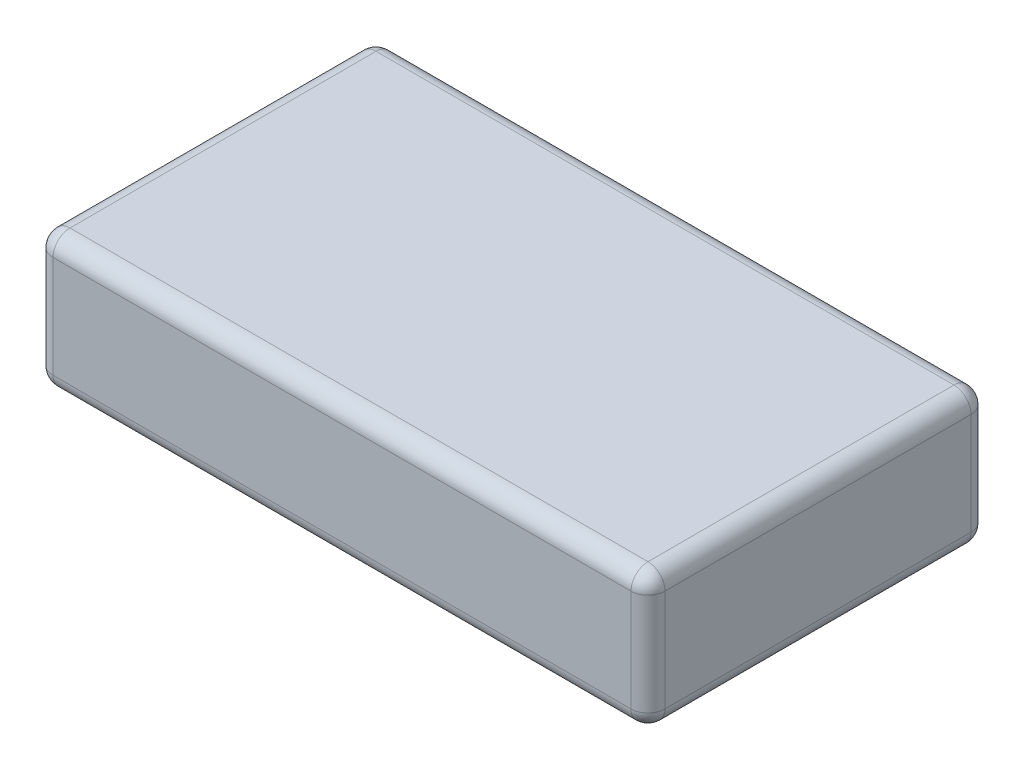
ISO-10303-21;
HEADER;
FILE_DESCRIPTION(('STEP AP214'),'2;1');
FILE_NAME('part.step','',(''),(''),'','','');
FILE_SCHEMA(('AUTOMOTIVE_DESIGN { 1 0 10303 214 1 1 1 1 }'));
ENDSEC;
DATA;
#1=APPLICATION_CONTEXT('core data for automotive mechanical design processes');
#2=APPLICATION_PROTOCOL_DEFINITION('international standard','automotive_design',2000,#1);
#3=PRODUCT_CONTEXT('',#1,'mechanical');
#4=PRODUCT('Part','Part','',(#3));
#5=PRODUCT_RELATED_PRODUCT_CATEGORY('part','',(#4));
#6=PRODUCT_DEFINITION_FORMATION('','',#4);
#7=PRODUCT_DEFINITION_CONTEXT('part definition',#1,'design');
#8=PRODUCT_DEFINITION('design','',#6,#7);
#9=PRODUCT_DEFINITION_SHAPE('','',#8);
#10=(LENGTH_UNIT() NAMED_UNIT(*) SI_UNIT(.MILLI.,.METRE.));
#11=(NAMED_UNIT(*) PLANE_ANGLE_UNIT() SI_UNIT($,.RADIAN.));
#12=(NAMED_UNIT(*) SI_UNIT($,.STERADIAN.) SOLID_ANGLE_UNIT());
#13=UNCERTAINTY_MEASURE_WITH_UNIT(LENGTH_MEASURE(1.E-05),#10,'distance_accuracy_value','');
#14=(GEOMETRIC_REPRESENTATION_CONTEXT(3) GLOBAL_UNCERTAINTY_ASSIGNED_CONTEXT((#13)) GLOBAL_UNIT_ASSIGNED_CONTEXT((#10,
#11,#12)) REPRESENTATION_CONTEXT('',''));
#15=CARTESIAN_POINT('',(0.,0.,0.));
#16=DIRECTION('',(0.,0.,1.));
#17=DIRECTION('',(1.,0.,0.));
#18=AXIS2_PLACEMENT_3D('',#15,#16,#17);
#19=CARTESIAN_POINT('',(-28.575,12.7,15.875));
#20=DIRECTION('',(1.,0.,0.));
#21=DIRECTION('',(0.,0.,-1.));
#22=AXIS2_PLACEMENT_3D('',#19,#20,#21);
#23=PLANE('',#22);
#24=DIRECTION('',(0.,-1.,0.));
#25=VECTOR('',#24,1.);
#26=CARTESIAN_POINT('',(-28.575,12.7,-14.2875));
#27=LINE('',#26,#25);
#28=CARTESIAN_POINT('',(-28.575,11.1125,-14.2875));
#29=VERTEX_POINT('',#28);
#30=CARTESIAN_POINT('',(-28.575,1.5875,-14.2875));
#31=VERTEX_POINT('',#30);
#32=EDGE_CURVE('E141',#29,#31,#27,.T.);
#33=ORIENTED_EDGE('',*,*,#32,.T.);
#34=DIRECTION('',(0.,0.,1.));
#35=VECTOR('',#34,1.);
#36=CARTESIAN_POINT('',(-28.575,1.5875,15.875));
#37=LINE('',#36,#35);
#38=CARTESIAN_POINT('',(-28.575,1.5875,14.2875));
#39=VERTEX_POINT('',#38);
#40=EDGE_CURVE('E188',#31,#39,#37,.T.);
#41=ORIENTED_EDGE('',*,*,#40,.T.);
#42=DIRECTION('',(0.,-1.,0.));
#43=VECTOR('',#42,1.);
#44=CARTESIAN_POINT('',(-28.575,12.7,14.2875));
#45=LINE('',#44,#43);
#46=CARTESIAN_POINT('',(-28.575,11.1125,14.2875));
#47=VERTEX_POINT('',#46);
#48=EDGE_CURVE('E185',#39,#47,#45,.F.);
#49=ORIENTED_EDGE('',*,*,#48,.T.);
#50=DIRECTION('',(0.,0.,1.));
#51=VECTOR('',#50,1.);
#52=CARTESIAN_POINT('',(-28.575,11.1125,15.875));
#53=LINE('',#52,#51);
#54=EDGE_CURVE('E183',#47,#29,#53,.F.);
#55=ORIENTED_EDGE('',*,*,#54,.T.);
#56=EDGE_LOOP('',(#33,#41,#49,#55));
#57=FACE_BOUND('',#56,.T.);
#58=ADVANCED_FACE('F33',(#57),#23,.F.);
#59=CARTESIAN_POINT('',(-28.575,12.7,15.875));
#60=DIRECTION('',(0.,0.,-1.));
#61=DIRECTION('',(-1.,0.,0.));
#62=AXIS2_PLACEMENT_3D('',#59,#60,#61);
#63=PLANE('',#62);
#64=DIRECTION('',(0.,-1.,0.));
#65=VECTOR('',#64,1.);
#66=CARTESIAN_POINT('',(-26.9875,12.7,15.875));
#67=LINE('',#66,#65);
#68=CARTESIAN_POINT('',(-26.9875,11.1125,15.875));
#69=VERTEX_POINT('',#68);
#70=CARTESIAN_POINT('',(-26.9875,1.5875,15.875));
#71=VERTEX_POINT('',#70);
#72=EDGE_CURVE('E176',#69,#71,#67,.T.);
#73=ORIENTED_EDGE('',*,*,#72,.T.);
#74=DIRECTION('',(1.,0.,0.));
#75=VECTOR('',#74,1.);
#76=CARTESIAN_POINT('',(28.575,1.5875,15.875));
#77=LINE('',#76,#75);
#78=CARTESIAN_POINT('',(26.9875,1.5875,15.875));
#79=VERTEX_POINT('',#78);
#80=EDGE_CURVE('E181',#71,#79,#77,.T.);
#81=ORIENTED_EDGE('',*,*,#80,.T.);
#82=DIRECTION('',(0.,-1.,0.));
#83=VECTOR('',#82,1.);
#84=CARTESIAN_POINT('',(26.9875,12.7,15.875));
#85=LINE('',#84,#83);
#86=CARTESIAN_POINT('',(26.9875,11.1125,15.875));
#87=VERTEX_POINT('',#86);
#88=EDGE_CURVE('E178',#79,#87,#85,.F.);
#89=ORIENTED_EDGE('',*,*,#88,.T.);
#90=DIRECTION('',(1.,0.,0.));
#91=VECTOR('',#90,1.);
#92=CARTESIAN_POINT('',(-28.575,11.1125,15.875));
#93=LINE('',#92,#91);
#94=EDGE_CURVE('E174',#87,#69,#93,.F.);
#95=ORIENTED_EDGE('',*,*,#94,.T.);
#96=EDGE_LOOP('',(#73,#81,#89,#95));
#97=FACE_BOUND('',#96,.T.);
#98=ADVANCED_FACE('F293',(#97),#63,.F.);
#99=CARTESIAN_POINT('',(28.575,12.7,15.875));
#100=DIRECTION('',(-1.,0.,0.));
#101=DIRECTION('',(0.,0.,1.));
#102=AXIS2_PLACEMENT_3D('',#99,#100,#101);
#103=PLANE('',#102);
#104=DIRECTION('',(0.,-1.,0.));
#105=VECTOR('',#104,1.);
#106=CARTESIAN_POINT('',(28.575,12.7,14.2875));
#107=LINE('',#106,#105);
#108=CARTESIAN_POINT('',(28.575,11.1125,14.2875));
#109=VERTEX_POINT('',#108);
#110=CARTESIAN_POINT('',(28.575,1.5875,14.2875));
#111=VERTEX_POINT('',#110);
#112=EDGE_CURVE('E167',#109,#111,#107,.T.);
#113=ORIENTED_EDGE('',*,*,#112,.T.);
#114=DIRECTION('',(0.,0.,-1.));
#115=VECTOR('',#114,1.);
#116=CARTESIAN_POINT('',(28.575,1.5875,-15.875));
#117=LINE('',#116,#115);
#118=CARTESIAN_POINT('',(28.575,1.5875,-14.2875));
#119=VERTEX_POINT('',#118);
#120=EDGE_CURVE('E172',#111,#119,#117,.T.);
#121=ORIENTED_EDGE('',*,*,#120,.T.);
#122=DIRECTION('',(0.,-1.,0.));
#123=VECTOR('',#122,1.);
#124=CARTESIAN_POINT('',(28.575,12.7,-14.2875));
#125=LINE('',#124,#123);
#126=CARTESIAN_POINT('',(28.575,11.1125,-14.2875));
#127=VERTEX_POINT('',#126);
#128=EDGE_CURVE('E169',#119,#127,#125,.F.);
#129=ORIENTED_EDGE('',*,*,#128,.T.);
#130=DIRECTION('',(0.,0.,-1.));
#131=VECTOR('',#130,1.);
#132=CARTESIAN_POINT('',(28.575,11.1125,15.875));
#133=LINE('',#132,#131);
#134=EDGE_CURVE('E165',#127,#109,#133,.F.);
#135=ORIENTED_EDGE('',*,*,#134,.T.);
#136=EDGE_LOOP('',(#113,#121,#129,#135));
#137=FACE_BOUND('',#136,.T.);
#138=ADVANCED_FACE('F284',(#137),#103,.F.);
#139=CARTESIAN_POINT('',(-28.575,12.7,-15.875));
#140=DIRECTION('',(0.,0.,1.));
#141=DIRECTION('',(1.,0.,0.));
#142=AXIS2_PLACEMENT_3D('',#139,#140,#141);
#143=PLANE('',#142);
#144=DIRECTION('',(0.,-1.,0.));
#145=VECTOR('',#144,1.);
#146=CARTESIAN_POINT('',(26.9875,12.7,-15.875));
#147=LINE('',#146,#145);
#148=CARTESIAN_POINT('',(26.9875,11.1125,-15.875));
#149=VERTEX_POINT('',#148);
#150=CARTESIAN_POINT('',(26.9875,1.5875,-15.875));
#151=VERTEX_POINT('',#150);
#152=EDGE_CURVE('E133',#149,#151,#147,.T.);
#153=ORIENTED_EDGE('',*,*,#152,.T.);
#154=DIRECTION('',(-1.,0.,0.));
#155=VECTOR('',#154,1.);
#156=CARTESIAN_POINT('',(-28.575,1.5875,-15.875));
#157=LINE('',#156,#155);
#158=CARTESIAN_POINT('',(-26.9875,1.5875,-15.875));
#159=VERTEX_POINT('',#158);
#160=EDGE_CURVE('E129',#151,#159,#157,.T.);
#161=ORIENTED_EDGE('',*,*,#160,.T.);
#162=DIRECTION('',(0.,-1.,0.));
#163=VECTOR('',#162,1.);
#164=CARTESIAN_POINT('',(-26.9875,12.7,-15.875));
#165=LINE('',#164,#163);
#166=CARTESIAN_POINT('',(-26.9875,11.1125,-15.875));
#167=VERTEX_POINT('',#166);
#168=EDGE_CURVE('E121',#159,#167,#165,.F.);
#169=ORIENTED_EDGE('',*,*,#168,.T.);
#170=DIRECTION('',(-1.,0.,0.));
#171=VECTOR('',#170,1.);
#172=CARTESIAN_POINT('',(-28.575,11.1125,-15.875));
#173=LINE('',#172,#171);
#174=EDGE_CURVE('E126',#167,#149,#173,.F.);
#175=ORIENTED_EDGE('',*,*,#174,.T.);
#176=EDGE_LOOP('',(#153,#161,#169,#175));
#177=FACE_BOUND('',#176,.T.);
#178=ADVANCED_FACE('F124',(#177),#143,.F.);
#179=CARTESIAN_POINT('',(0.,12.7,0.));
#180=DIRECTION('',(0.,-1.,0.));
#181=DIRECTION('',(0.,0.,-1.));
#182=AXIS2_PLACEMENT_3D('',#179,#180,#181);
#183=PLANE('',#182);
#184=DIRECTION('',(0.,0.,-1.));
#185=VECTOR('',#184,1.);
#186=CARTESIAN_POINT('',(26.9875,12.7,0.));
#187=LINE('',#186,#185);
#188=CARTESIAN_POINT('',(26.9875,12.7,14.2875));
#189=VERTEX_POINT('',#188);
#190=CARTESIAN_POINT('',(26.9875,12.7,-14.2875));
#191=VERTEX_POINT('',#190);
#192=EDGE_CURVE('E42',#189,#191,#187,.T.);
#193=ORIENTED_EDGE('',*,*,#192,.T.);
#194=DIRECTION('',(-1.,0.,0.));
#195=VECTOR('',#194,1.);
#196=CARTESIAN_POINT('',(0.,12.7,-14.2875));
#197=LINE('',#196,#195);
#198=CARTESIAN_POINT('',(-26.9875,12.7,-14.2875));
#199=VERTEX_POINT('',#198);
#200=EDGE_CURVE('E11',#191,#199,#197,.T.);
#201=ORIENTED_EDGE('',*,*,#200,.T.);
#202=DIRECTION('',(0.,0.,1.));
#203=VECTOR('',#202,1.);
#204=CARTESIAN_POINT('',(-26.9875,12.7,0.));
#205=LINE('',#204,#203);
#206=CARTESIAN_POINT('',(-26.9875,12.7,14.2875));
#207=VERTEX_POINT('',#206);
#208=EDGE_CURVE('E199',#199,#207,#205,.T.);
#209=ORIENTED_EDGE('',*,*,#208,.T.);
#210=DIRECTION('',(1.,0.,0.));
#211=VECTOR('',#210,1.);
#212=CARTESIAN_POINT('',(0.,12.7,14.2875));
#213=LINE('',#212,#211);
#214=EDGE_CURVE('E53',#207,#189,#213,.T.);
#215=ORIENTED_EDGE('',*,*,#214,.T.);
#216=EDGE_LOOP('',(#193,#201,#209,#215));
#217=FACE_BOUND('',#216,.T.);
#218=ADVANCED_FACE('F483',(#217),#183,.F.);
#219=CARTESIAN_POINT('',(0.,0.,0.));
#220=DIRECTION('',(0.,-1.,0.));
#221=DIRECTION('',(0.,0.,-1.));
#222=AXIS2_PLACEMENT_3D('',#219,#220,#221);
#223=PLANE('',#222);
#224=DIRECTION('',(0.,0.,-1.));
#225=VECTOR('',#224,1.);
#226=CARTESIAN_POINT('',(26.9875,0.,15.875));
#227=LINE('',#226,#225);
#228=CARTESIAN_POINT('',(26.9875,0.,-14.2875));
#229=VERTEX_POINT('',#228);
#230=CARTESIAN_POINT('',(26.9875,0.,14.2875));
#231=VERTEX_POINT('',#230);
#232=EDGE_CURVE('E194',#229,#231,#227,.F.);
#233=ORIENTED_EDGE('',*,*,#232,.T.);
#234=DIRECTION('',(1.,0.,0.));
#235=VECTOR('',#234,1.);
#236=CARTESIAN_POINT('',(-28.575,0.,14.2875));
#237=LINE('',#236,#235);
#238=CARTESIAN_POINT('',(-26.9875,0.,14.2875));
#239=VERTEX_POINT('',#238);
#240=EDGE_CURVE('E196',#231,#239,#237,.F.);
#241=ORIENTED_EDGE('',*,*,#240,.T.);
#242=DIRECTION('',(0.,0.,1.));
#243=VECTOR('',#242,1.);
#244=CARTESIAN_POINT('',(-26.9875,0.,-15.875));
#245=LINE('',#244,#243);
#246=CARTESIAN_POINT('',(-26.9875,0.,-14.2875));
#247=VERTEX_POINT('',#246);
#248=EDGE_CURVE('E190',#239,#247,#245,.F.);
#249=ORIENTED_EDGE('',*,*,#248,.T.);
#250=DIRECTION('',(-1.,0.,0.));
#251=VECTOR('',#250,1.);
#252=CARTESIAN_POINT('',(28.575,0.,-14.2875));
#253=LINE('',#252,#251);
#254=EDGE_CURVE('E192',#247,#229,#253,.F.);
#255=ORIENTED_EDGE('',*,*,#254,.T.);
#256=EDGE_LOOP('',(#233,#241,#249,#255));
#257=FACE_BOUND('',#256,.T.);
#258=ADVANCED_FACE('F266',(#257),#223,.T.);
#259=CARTESIAN_POINT('',(-26.9875,12.7,14.2875));
#260=DIRECTION('',(0.,-1.,0.));
#261=DIRECTION('',(0.,0.,-1.));
#262=AXIS2_PLACEMENT_3D('',#259,#260,#261);
#263=CYLINDRICAL_SURFACE('',#262,1.5875);
#264=CARTESIAN_POINT('',(-26.9875,11.1125,14.2875));
#265=DIRECTION('',(0.,1.,0.));
#266=DIRECTION('',(0.,0.,1.));
#267=AXIS2_PLACEMENT_3D('',#264,#265,#266);
#268=CIRCLE('',#267,1.5875);
#269=EDGE_CURVE('E37',#47,#69,#268,.T.);
#270=ORIENTED_EDGE('',*,*,#269,.F.);
#271=ORIENTED_EDGE('',*,*,#48,.F.);
#272=CARTESIAN_POINT('',(-26.9875,1.5875,14.2875));
#273=DIRECTION('',(0.,-1.,0.));
#274=DIRECTION('',(0.,0.,-1.));
#275=AXIS2_PLACEMENT_3D('',#272,#273,#274);
#276=CIRCLE('',#275,1.5875);
#277=EDGE_CURVE('E161',#71,#39,#276,.T.);
#278=ORIENTED_EDGE('',*,*,#277,.F.);
#279=ORIENTED_EDGE('',*,*,#72,.F.);
#280=EDGE_LOOP('',(#270,#271,#278,#279));
#281=FACE_BOUND('',#280,.T.);
#282=ADVANCED_FACE('F35',(#281),#263,.T.);
#283=CARTESIAN_POINT('',(-26.9875,11.1125,14.2875));
#284=DIRECTION('',(0.,0.,1.));
#285=DIRECTION('',(1.,0.,0.));
#286=AXIS2_PLACEMENT_3D('',#283,#284,#285);
#287=SPHERICAL_SURFACE('',#286,1.5875);
#288=CARTESIAN_POINT('',(-26.9875,11.1125,14.2875));
#289=DIRECTION('',(0.,0.,1.));
#290=DIRECTION('',(1.,0.,0.));
#291=AXIS2_PLACEMENT_3D('',#288,#289,#290);
#292=CIRCLE('',#291,1.5875);
#293=EDGE_CURVE('E245',#47,#207,#292,.F.);
#294=ORIENTED_EDGE('',*,*,#293,.F.);
#295=ORIENTED_EDGE('',*,*,#269,.T.);
#296=CARTESIAN_POINT('',(-26.9875,11.1125,14.2875));
#297=DIRECTION('',(-1.,0.,0.));
#298=DIRECTION('',(0.,0.,1.));
#299=AXIS2_PLACEMENT_3D('',#296,#297,#298);
#300=CIRCLE('',#299,1.5875);
#301=EDGE_CURVE('E248',#207,#69,#300,.F.);
#302=ORIENTED_EDGE('',*,*,#301,.F.);
#303=EDGE_LOOP('',(#294,#295,#302));
#304=FACE_BOUND('',#303,.T.);
#305=ADVANCED_FACE('F298',(#304),#287,.T.);
#306=CARTESIAN_POINT('',(-26.9875,1.5875,14.2875));
#307=DIRECTION('',(-1.,0.,0.));
#308=DIRECTION('',(0.,-1.,0.));
#309=AXIS2_PLACEMENT_3D('',#306,#307,#308);
#310=SPHERICAL_SURFACE('',#309,1.5875);
#311=CARTESIAN_POINT('',(-26.9875,1.5875,14.2875));
#312=DIRECTION('',(-1.,0.,0.));
#313=DIRECTION('',(0.,0.,1.));
#314=AXIS2_PLACEMENT_3D('',#311,#312,#313);
#315=CIRCLE('',#314,1.5875);
#316=EDGE_CURVE('E239',#71,#239,#315,.F.);
#317=ORIENTED_EDGE('',*,*,#316,.F.);
#318=ORIENTED_EDGE('',*,*,#277,.T.);
#319=CARTESIAN_POINT('',(-26.9875,1.5875,14.2875));
#320=DIRECTION('',(0.,0.,1.));
#321=DIRECTION('',(1.,0.,0.));
#322=AXIS2_PLACEMENT_3D('',#319,#320,#321);
#323=CIRCLE('',#322,1.5875);
#324=EDGE_CURVE('E242',#239,#39,#323,.F.);
#325=ORIENTED_EDGE('',*,*,#324,.F.);
#326=EDGE_LOOP('',(#317,#318,#325));
#327=FACE_BOUND('',#326,.T.);
#328=ADVANCED_FACE('F255',(#327),#310,.T.);
#329=CARTESIAN_POINT('',(0.,11.1125,14.2875));
#330=DIRECTION('',(1.,0.,0.));
#331=DIRECTION('',(0.,0.,-1.));
#332=AXIS2_PLACEMENT_3D('',#329,#330,#331);
#333=CYLINDRICAL_SURFACE('',#332,1.5875);
#334=ORIENTED_EDGE('',*,*,#301,.T.);
#335=ORIENTED_EDGE('',*,*,#94,.F.);
#336=CARTESIAN_POINT('',(26.9875,11.1125,14.2875));
#337=DIRECTION('',(1.,0.,0.));
#338=DIRECTION('',(0.,0.,-1.));
#339=AXIS2_PLACEMENT_3D('',#336,#337,#338);
#340=CIRCLE('',#339,1.5875);
#341=EDGE_CURVE('E234',#189,#87,#340,.T.);
#342=ORIENTED_EDGE('',*,*,#341,.F.);
#343=ORIENTED_EDGE('',*,*,#214,.F.);
#344=EDGE_LOOP('',(#334,#335,#342,#343));
#345=FACE_BOUND('',#344,.T.);
#346=ADVANCED_FACE('F301',(#345),#333,.T.);
#347=CARTESIAN_POINT('',(-26.9875,11.1125,0.));
#348=DIRECTION('',(0.,0.,1.));
#349=DIRECTION('',(1.,0.,0.));
#350=AXIS2_PLACEMENT_3D('',#347,#348,#349);
#351=CYLINDRICAL_SURFACE('',#350,1.5875);
#352=ORIENTED_EDGE('',*,*,#293,.T.);
#353=ORIENTED_EDGE('',*,*,#208,.F.);
#354=CARTESIAN_POINT('',(-26.9875,11.1125,-14.2875));
#355=DIRECTION('',(0.,0.,-1.));
#356=DIRECTION('',(0.,1.,0.));
#357=AXIS2_PLACEMENT_3D('',#354,#355,#356);
#358=CIRCLE('',#357,1.5875);
#359=EDGE_CURVE('E145',#29,#199,#358,.T.);
#360=ORIENTED_EDGE('',*,*,#359,.F.);
#361=ORIENTED_EDGE('',*,*,#54,.F.);
#362=EDGE_LOOP('',(#352,#353,#360,#361));
#363=FACE_BOUND('',#362,.T.);
#364=ADVANCED_FACE('F441',(#363),#351,.T.);
#365=CARTESIAN_POINT('',(-26.9875,12.7,-14.2875));
#366=DIRECTION('',(0.,-1.,0.));
#367=DIRECTION('',(0.,0.,-1.));
#368=AXIS2_PLACEMENT_3D('',#365,#366,#367);
#369=CYLINDRICAL_SURFACE('',#368,1.5875);
#370=CARTESIAN_POINT('',(-26.9875,1.5875,-14.2875));
#371=DIRECTION('',(0.,-1.,0.));
#372=DIRECTION('',(0.,0.,-1.));
#373=AXIS2_PLACEMENT_3D('',#370,#371,#372);
#374=CIRCLE('',#373,1.5875);
#375=EDGE_CURVE('E146',#31,#159,#374,.T.);
#376=ORIENTED_EDGE('',*,*,#375,.F.);
#377=ORIENTED_EDGE('',*,*,#32,.F.);
#378=CARTESIAN_POINT('',(-26.9875,11.1125,-14.2875));
#379=DIRECTION('',(0.,1.,0.));
#380=DIRECTION('',(0.,0.,1.));
#381=AXIS2_PLACEMENT_3D('',#378,#379,#380);
#382=CIRCLE('',#381,1.5875);
#383=EDGE_CURVE('E137',#167,#29,#382,.T.);
#384=ORIENTED_EDGE('',*,*,#383,.F.);
#385=ORIENTED_EDGE('',*,*,#168,.F.);
#386=EDGE_LOOP('',(#376,#377,#384,#385));
#387=FACE_BOUND('',#386,.T.);
#388=ADVANCED_FACE('F139',(#387),#369,.T.);
#389=CARTESIAN_POINT('',(-26.9875,1.5875,15.875));
#390=DIRECTION('',(0.,0.,-1.));
#391=DIRECTION('',(-1.,0.,0.));
#392=AXIS2_PLACEMENT_3D('',#389,#390,#391);
#393=CYLINDRICAL_SURFACE('',#392,1.5875);
#394=ORIENTED_EDGE('',*,*,#324,.T.);
#395=ORIENTED_EDGE('',*,*,#40,.F.);
#396=CARTESIAN_POINT('',(-26.9875,1.5875,-14.2875));
#397=DIRECTION('',(0.,0.,-1.));
#398=DIRECTION('',(-1.,0.,0.));
#399=AXIS2_PLACEMENT_3D('',#396,#397,#398);
#400=CIRCLE('',#399,1.5875);
#401=EDGE_CURVE('E230',#247,#31,#400,.T.);
#402=ORIENTED_EDGE('',*,*,#401,.F.);
#403=ORIENTED_EDGE('',*,*,#248,.F.);
#404=EDGE_LOOP('',(#394,#395,#402,#403));
#405=FACE_BOUND('',#404,.T.);
#406=ADVANCED_FACE('F262',(#405),#393,.T.);
#407=CARTESIAN_POINT('',(-28.575,1.5875,14.2875));
#408=DIRECTION('',(-1.,0.,0.));
#409=DIRECTION('',(0.,0.,1.));
#410=AXIS2_PLACEMENT_3D('',#407,#408,#409);
#411=CYLINDRICAL_SURFACE('',#410,1.5875);
#412=ORIENTED_EDGE('',*,*,#316,.T.);
#413=ORIENTED_EDGE('',*,*,#240,.F.);
#414=CARTESIAN_POINT('',(26.9875,1.5875,14.2875));
#415=DIRECTION('',(1.,0.,0.));
#416=DIRECTION('',(0.,0.,-1.));
#417=AXIS2_PLACEMENT_3D('',#414,#415,#416);
#418=CIRCLE('',#417,1.5875);
#419=EDGE_CURVE('E227',#79,#231,#418,.T.);
#420=ORIENTED_EDGE('',*,*,#419,.F.);
#421=ORIENTED_EDGE('',*,*,#80,.F.);
#422=EDGE_LOOP('',(#412,#413,#420,#421));
#423=FACE_BOUND('',#422,.T.);
#424=ADVANCED_FACE('F272',(#423),#411,.T.);
#425=CARTESIAN_POINT('',(26.9875,12.7,14.2875));
#426=DIRECTION('',(0.,-1.,0.));
#427=DIRECTION('',(0.,0.,-1.));
#428=AXIS2_PLACEMENT_3D('',#425,#426,#427);
#429=CYLINDRICAL_SURFACE('',#428,1.5875);
#430=CARTESIAN_POINT('',(26.9875,11.1125,14.2875));
#431=DIRECTION('',(0.,1.,0.));
#432=DIRECTION('',(0.,0.,1.));
#433=AXIS2_PLACEMENT_3D('',#430,#431,#432);
#434=CIRCLE('',#433,1.5875);
#435=EDGE_CURVE('E236',#87,#109,#434,.T.);
#436=ORIENTED_EDGE('',*,*,#435,.F.);
#437=ORIENTED_EDGE('',*,*,#88,.F.);
#438=CARTESIAN_POINT('',(26.9875,1.5875,14.2875));
#439=DIRECTION('',(0.,-1.,0.));
#440=DIRECTION('',(0.,0.,-1.));
#441=AXIS2_PLACEMENT_3D('',#438,#439,#440);
#442=CIRCLE('',#441,1.5875);
#443=EDGE_CURVE('E224',#111,#79,#442,.T.);
#444=ORIENTED_EDGE('',*,*,#443,.F.);
#445=ORIENTED_EDGE('',*,*,#112,.F.);
#446=EDGE_LOOP('',(#436,#437,#444,#445));
#447=FACE_BOUND('',#446,.T.);
#448=ADVANCED_FACE('F290',(#447),#429,.T.);
#449=CARTESIAN_POINT('',(26.9875,11.1125,14.2875));
#450=DIRECTION('',(0.,0.,1.));
#451=DIRECTION('',(1.,0.,0.));
#452=AXIS2_PLACEMENT_3D('',#449,#450,#451);
#453=SPHERICAL_SURFACE('',#452,1.5875);
#454=ORIENTED_EDGE('',*,*,#341,.T.);
#455=ORIENTED_EDGE('',*,*,#435,.T.);
#456=CARTESIAN_POINT('',(26.9875,11.1125,14.2875));
#457=DIRECTION('',(0.,0.,1.));
#458=DIRECTION('',(1.,0.,0.));
#459=AXIS2_PLACEMENT_3D('',#456,#457,#458);
#460=CIRCLE('',#459,1.5875);
#461=EDGE_CURVE('E152',#189,#109,#460,.F.);
#462=ORIENTED_EDGE('',*,*,#461,.F.);
#463=EDGE_LOOP('',(#454,#455,#462));
#464=FACE_BOUND('',#463,.T.);
#465=ADVANCED_FACE('F304',(#464),#453,.T.);
#466=CARTESIAN_POINT('',(-26.9875,11.1125,-14.2875));
#467=DIRECTION('',(-1.,0.,0.));
#468=DIRECTION('',(0.,0.,1.));
#469=AXIS2_PLACEMENT_3D('',#466,#467,#468);
#470=SPHERICAL_SURFACE('',#469,1.5875);
#471=ORIENTED_EDGE('',*,*,#383,.T.);
#472=ORIENTED_EDGE('',*,*,#359,.T.);
#473=CARTESIAN_POINT('',(-26.9875,11.1125,-14.2875));
#474=DIRECTION('',(-1.,0.,0.));
#475=DIRECTION('',(0.,0.,1.));
#476=AXIS2_PLACEMENT_3D('',#473,#474,#475);
#477=CIRCLE('',#476,1.5875);
#478=EDGE_CURVE('E148',#167,#199,#477,.F.);
#479=ORIENTED_EDGE('',*,*,#478,.F.);
#480=EDGE_LOOP('',(#471,#472,#479));
#481=FACE_BOUND('',#480,.T.);
#482=ADVANCED_FACE('F149',(#481),#470,.T.);
#483=CARTESIAN_POINT('',(-26.9875,1.5875,-14.2875));
#484=DIRECTION('',(-1.,0.,0.));
#485=DIRECTION('',(0.,0.,1.));
#486=AXIS2_PLACEMENT_3D('',#483,#484,#485);
#487=SPHERICAL_SURFACE('',#486,1.5875);
#488=ORIENTED_EDGE('',*,*,#401,.T.);
#489=ORIENTED_EDGE('',*,*,#375,.T.);
#490=CARTESIAN_POINT('',(-26.9875,1.5875,-14.2875));
#491=DIRECTION('',(-1.,0.,0.));
#492=DIRECTION('',(0.,0.,1.));
#493=AXIS2_PLACEMENT_3D('',#490,#491,#492);
#494=CIRCLE('',#493,1.5875);
#495=EDGE_CURVE('E153',#247,#159,#494,.F.);
#496=ORIENTED_EDGE('',*,*,#495,.F.);
#497=EDGE_LOOP('',(#488,#489,#496));
#498=FACE_BOUND('',#497,.T.);
#499=ADVANCED_FACE('F319',(#498),#487,.T.);
#500=CARTESIAN_POINT('',(26.9875,1.5875,14.2875));
#501=DIRECTION('',(0.,0.,1.));
#502=DIRECTION('',(0.,-1.,0.));
#503=AXIS2_PLACEMENT_3D('',#500,#501,#502);
#504=SPHERICAL_SURFACE('',#503,1.5875);
#505=ORIENTED_EDGE('',*,*,#443,.T.);
#506=ORIENTED_EDGE('',*,*,#419,.T.);
#507=CARTESIAN_POINT('',(26.9875,1.5875,14.2875));
#508=DIRECTION('',(0.,0.,1.));
#509=DIRECTION('',(1.,0.,0.));
#510=AXIS2_PLACEMENT_3D('',#507,#508,#509);
#511=CIRCLE('',#510,1.5875);
#512=EDGE_CURVE('E217',#111,#231,#511,.F.);
#513=ORIENTED_EDGE('',*,*,#512,.F.);
#514=EDGE_LOOP('',(#505,#506,#513));
#515=FACE_BOUND('',#514,.T.);
#516=ADVANCED_FACE('F275',(#515),#504,.T.);
#517=CARTESIAN_POINT('',(26.9875,11.1125,0.));
#518=DIRECTION('',(0.,0.,-1.));
#519=DIRECTION('',(-1.,0.,0.));
#520=AXIS2_PLACEMENT_3D('',#517,#518,#519);
#521=CYLINDRICAL_SURFACE('',#520,1.5875);
#522=ORIENTED_EDGE('',*,*,#461,.T.);
#523=ORIENTED_EDGE('',*,*,#134,.F.);
#524=CARTESIAN_POINT('',(26.9875,11.1125,-14.2875));
#525=DIRECTION('',(0.,0.,-1.));
#526=DIRECTION('',(-1.,0.,0.));
#527=AXIS2_PLACEMENT_3D('',#524,#525,#526);
#528=CIRCLE('',#527,1.5875);
#529=EDGE_CURVE('E214',#191,#127,#528,.T.);
#530=ORIENTED_EDGE('',*,*,#529,.F.);
#531=ORIENTED_EDGE('',*,*,#192,.F.);
#532=EDGE_LOOP('',(#522,#523,#530,#531));
#533=FACE_BOUND('',#532,.T.);
#534=ADVANCED_FACE('F307',(#533),#521,.T.);
#535=CARTESIAN_POINT('',(0.,11.1125,-14.2875));
#536=DIRECTION('',(-1.,0.,0.));
#537=DIRECTION('',(0.,0.,1.));
#538=AXIS2_PLACEMENT_3D('',#535,#536,#537);
#539=CYLINDRICAL_SURFACE('',#538,1.5875);
#540=ORIENTED_EDGE('',*,*,#478,.T.);
#541=ORIENTED_EDGE('',*,*,#200,.F.);
#542=CARTESIAN_POINT('',(26.9875,11.1125,-14.2875));
#543=DIRECTION('',(1.,0.,0.));
#544=DIRECTION('',(0.,0.,-1.));
#545=AXIS2_PLACEMENT_3D('',#542,#543,#544);
#546=CIRCLE('',#545,1.5875);
#547=EDGE_CURVE('E157',#149,#191,#546,.T.);
#548=ORIENTED_EDGE('',*,*,#547,.F.);
#549=ORIENTED_EDGE('',*,*,#174,.F.);
#550=EDGE_LOOP('',(#540,#541,#548,#549));
#551=FACE_BOUND('',#550,.T.);
#552=ADVANCED_FACE('F155',(#551),#539,.T.);
#553=CARTESIAN_POINT('',(-28.575,1.5875,-14.2875));
#554=DIRECTION('',(1.,0.,0.));
#555=DIRECTION('',(0.,0.,-1.));
#556=AXIS2_PLACEMENT_3D('',#553,#554,#555);
#557=CYLINDRICAL_SURFACE('',#556,1.5875);
#558=ORIENTED_EDGE('',*,*,#495,.T.);
#559=ORIENTED_EDGE('',*,*,#160,.F.);
#560=CARTESIAN_POINT('',(26.9875,1.5875,-14.2875));
#561=DIRECTION('',(1.,0.,0.));
#562=DIRECTION('',(0.,0.,-1.));
#563=AXIS2_PLACEMENT_3D('',#560,#561,#562);
#564=CIRCLE('',#563,1.5875);
#565=EDGE_CURVE('E210',#229,#151,#564,.T.);
#566=ORIENTED_EDGE('',*,*,#565,.F.);
#567=ORIENTED_EDGE('',*,*,#254,.F.);
#568=EDGE_LOOP('',(#558,#559,#566,#567));
#569=FACE_BOUND('',#568,.T.);
#570=ADVANCED_FACE('F317',(#569),#557,.T.);
#571=CARTESIAN_POINT('',(26.9875,1.5875,15.875));
#572=DIRECTION('',(0.,0.,1.));
#573=DIRECTION('',(1.,0.,0.));
#574=AXIS2_PLACEMENT_3D('',#571,#572,#573);
#575=CYLINDRICAL_SURFACE('',#574,1.5875);
#576=ORIENTED_EDGE('',*,*,#512,.T.);
#577=ORIENTED_EDGE('',*,*,#232,.F.);
#578=CARTESIAN_POINT('',(26.9875,1.5875,-14.2875));
#579=DIRECTION('',(0.,0.,-1.));
#580=DIRECTION('',(-1.,0.,0.));
#581=AXIS2_PLACEMENT_3D('',#578,#579,#580);
#582=CIRCLE('',#581,1.5875);
#583=EDGE_CURVE('E207',#119,#229,#582,.T.);
#584=ORIENTED_EDGE('',*,*,#583,.F.);
#585=ORIENTED_EDGE('',*,*,#120,.F.);
#586=EDGE_LOOP('',(#576,#577,#584,#585));
#587=FACE_BOUND('',#586,.T.);
#588=ADVANCED_FACE('F279',(#587),#575,.T.);
#589=CARTESIAN_POINT('',(26.9875,11.1125,-14.2875));
#590=DIRECTION('',(0.,1.,0.));
#591=DIRECTION('',(0.,0.,1.));
#592=AXIS2_PLACEMENT_3D('',#589,#590,#591);
#593=SPHERICAL_SURFACE('',#592,1.5875);
#594=ORIENTED_EDGE('',*,*,#547,.T.);
#595=ORIENTED_EDGE('',*,*,#529,.T.);
#596=CARTESIAN_POINT('',(26.9875,11.1125,-14.2875));
#597=DIRECTION('',(0.,1.,0.));
#598=DIRECTION('',(0.,0.,1.));
#599=AXIS2_PLACEMENT_3D('',#596,#597,#598);
#600=CIRCLE('',#599,1.5875);
#601=EDGE_CURVE('E205',#149,#127,#600,.F.);
#602=ORIENTED_EDGE('',*,*,#601,.F.);
#603=EDGE_LOOP('',(#594,#595,#602));
#604=FACE_BOUND('',#603,.T.);
#605=ADVANCED_FACE('F309',(#604),#593,.T.);
#606=CARTESIAN_POINT('',(26.9875,1.5875,-14.2875));
#607=DIRECTION('',(0.,-1.,0.));
#608=DIRECTION('',(0.,0.,-1.));
#609=AXIS2_PLACEMENT_3D('',#606,#607,#608);
#610=SPHERICAL_SURFACE('',#609,1.5875);
#611=ORIENTED_EDGE('',*,*,#583,.T.);
#612=ORIENTED_EDGE('',*,*,#565,.T.);
#613=CARTESIAN_POINT('',(26.9875,1.5875,-14.2875));
#614=DIRECTION('',(0.,-1.,0.));
#615=DIRECTION('',(0.,0.,-1.));
#616=AXIS2_PLACEMENT_3D('',#613,#614,#615);
#617=CIRCLE('',#616,1.5875);
#618=EDGE_CURVE('E203',#119,#151,#617,.F.);
#619=ORIENTED_EDGE('',*,*,#618,.F.);
#620=EDGE_LOOP('',(#611,#612,#619));
#621=FACE_BOUND('',#620,.T.);
#622=ADVANCED_FACE('F315',(#621),#610,.T.);
#623=CARTESIAN_POINT('',(26.9875,12.7,-14.2875));
#624=DIRECTION('',(0.,-1.,0.));
#625=DIRECTION('',(0.,0.,-1.));
#626=AXIS2_PLACEMENT_3D('',#623,#624,#625);
#627=CYLINDRICAL_SURFACE('',#626,1.5875);
#628=ORIENTED_EDGE('',*,*,#601,.T.);
#629=ORIENTED_EDGE('',*,*,#128,.F.);
#630=ORIENTED_EDGE('',*,*,#618,.T.);
#631=ORIENTED_EDGE('',*,*,#152,.F.);
#632=EDGE_LOOP('',(#628,#629,#630,#631));
#633=FACE_BOUND('',#632,.T.);
#634=ADVANCED_FACE('F312',(#633),#627,.T.);
#635=CLOSED_SHELL('',(#58,#98,#138,#178,#218,#258,#282,#305,#328,#346,#364,#388,#406,#424,#448,
#465,#482,#499,#516,#534,#552,#570,#588,#605,#622,#634));
#636=MANIFOLD_SOLID_BREP('B2',#635);
#637=ADVANCED_BREP_SHAPE_REPRESENTATION('',(#18,#636),#14);
#638=SHAPE_DEFINITION_REPRESENTATION(#9,#637);
ENDSEC;
END-ISO-10303-21;
